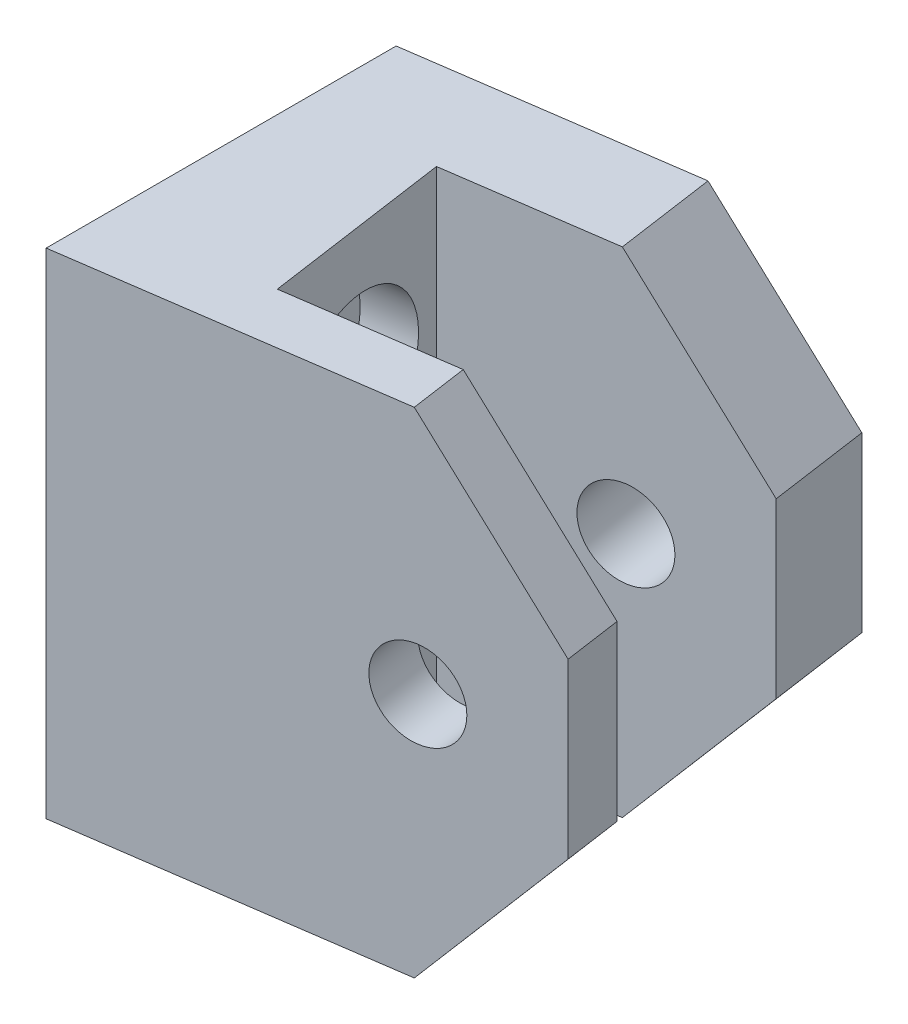
ISO-10303-21;
HEADER;
FILE_DESCRIPTION(('STEP AP214'),'2;1');
FILE_NAME('part.step','',(''),(''),'','','');
FILE_SCHEMA(('AUTOMOTIVE_DESIGN { 1 0 10303 214 1 1 1 1 }'));
ENDSEC;
DATA;
#1=APPLICATION_CONTEXT('core data for automotive mechanical design processes');
#2=APPLICATION_PROTOCOL_DEFINITION('international standard','automotive_design',2000,#1);
#3=PRODUCT_CONTEXT('',#1,'mechanical');
#4=PRODUCT('Part','Part','',(#3));
#5=PRODUCT_RELATED_PRODUCT_CATEGORY('part','',(#4));
#6=PRODUCT_DEFINITION_FORMATION('','',#4);
#7=PRODUCT_DEFINITION_CONTEXT('part definition',#1,'design');
#8=PRODUCT_DEFINITION('design','',#6,#7);
#9=PRODUCT_DEFINITION_SHAPE('','',#8);
#10=(LENGTH_UNIT() NAMED_UNIT(*) SI_UNIT(.MILLI.,.METRE.));
#11=(NAMED_UNIT(*) PLANE_ANGLE_UNIT() SI_UNIT($,.RADIAN.));
#12=(NAMED_UNIT(*) SI_UNIT($,.STERADIAN.) SOLID_ANGLE_UNIT());
#13=UNCERTAINTY_MEASURE_WITH_UNIT(LENGTH_MEASURE(1.E-05),#10,'distance_accuracy_value','');
#14=(GEOMETRIC_REPRESENTATION_CONTEXT(3) GLOBAL_UNCERTAINTY_ASSIGNED_CONTEXT((#13)) GLOBAL_UNIT_ASSIGNED_CONTEXT((#10,
#11,#12)) REPRESENTATION_CONTEXT('',''));
#15=CARTESIAN_POINT('',(0.,0.,0.));
#16=DIRECTION('',(0.,0.,1.));
#17=DIRECTION('',(1.,0.,0.));
#18=AXIS2_PLACEMENT_3D('',#15,#16,#17);
#19=CARTESIAN_POINT('',(-1.90500000579084,54.37886,33.9650340772844));
#20=DIRECTION('',(1.,0.,-8.04481674826941E-13));
#21=DIRECTION('',(-8.04481674826941E-13,0.,-1.));
#22=AXIS2_PLACEMENT_3D('',#19,#20,#21);
#23=PLANE('',#22);
#24=CARTESIAN_POINT('',(-1.9050000058044,39.88943,17.1191776297874));
#25=DIRECTION('',(1.,0.,-8.04481674826941E-13));
#26=DIRECTION('',(-8.04481674826941E-13,0.,-1.));
#27=AXIS2_PLACEMENT_3D('',#24,#25,#26);
#28=ELLIPSE('',#27,4.54608092387669,4.5);
#29=CARTESIAN_POINT('',(-1.90500000580805,39.88943,12.5730967059107));
#30=VERTEX_POINT('',#29);
#31=EDGE_CURVE('E50',#30,#30,#28,.T.);
#32=ORIENTED_EDGE('',*,*,#31,.T.);
#33=EDGE_LOOP('',(#32));
#34=FACE_BOUND('',#33,.T.);
#35=CARTESIAN_POINT('',(-1.9050000058044,14.48943,17.1191776297874));
#36=DIRECTION('',(1.,0.,-8.04481674826941E-13));
#37=DIRECTION('',(-8.04481674826941E-13,0.,-1.));
#38=AXIS2_PLACEMENT_3D('',#35,#36,#37);
#39=ELLIPSE('',#38,4.54608092387669,4.5);
#40=CARTESIAN_POINT('',(-1.90500000580805,14.48943,12.5730967059107));
#41=VERTEX_POINT('',#40);
#42=EDGE_CURVE('E215',#41,#41,#39,.T.);
#43=ORIENTED_EDGE('',*,*,#42,.T.);
#44=EDGE_LOOP('',(#43));
#45=FACE_BOUND('',#44,.T.);
#46=DIRECTION('',(8.04481674826941E-13,0.,1.));
#47=VECTOR('',#46,1.);
#48=CARTESIAN_POINT('',(-1.90500000579084,0.,33.9650340772844));
#49=LINE('',#48,#47);
#50=CARTESIAN_POINT('',(-1.90500000579084,0.,-4.5379477954834));
#51=VERTEX_POINT('',#50);
#52=CARTESIAN_POINT('',(-1.90500000579084,0.,33.9650340772844));
#53=VERTEX_POINT('',#52);
#54=EDGE_CURVE('E172',#51,#53,#49,.T.);
#55=ORIENTED_EDGE('',*,*,#54,.T.);
#56=DIRECTION('',(0.,-1.,0.));
#57=VECTOR('',#56,1.);
#58=CARTESIAN_POINT('',(-1.90500000579084,54.37886,33.9650340772844));
#59=LINE('',#58,#57);
#60=CARTESIAN_POINT('',(-1.90500000579084,54.37886,33.9650340772844));
#61=VERTEX_POINT('',#60);
#62=EDGE_CURVE('E206',#61,#53,#59,.T.);
#63=ORIENTED_EDGE('',*,*,#62,.F.);
#64=DIRECTION('',(0.,0.,1.));
#65=VECTOR('',#64,1.);
#66=CARTESIAN_POINT('',(-1.90500000579084,54.37886,-4.5379477954834));
#67=LINE('',#66,#65);
#68=CARTESIAN_POINT('',(-1.90500000579084,54.37886,-4.5379477954834));
#69=VERTEX_POINT('',#68);
#70=EDGE_CURVE('E155',#69,#61,#67,.T.);
#71=ORIENTED_EDGE('',*,*,#70,.F.);
#72=DIRECTION('',(0.,-1.,0.));
#73=VECTOR('',#72,1.);
#74=CARTESIAN_POINT('',(-1.90500000579084,54.37886,-4.5379477954834));
#75=LINE('',#74,#73);
#76=EDGE_CURVE('E171',#69,#51,#75,.T.);
#77=ORIENTED_EDGE('',*,*,#76,.T.);
#78=EDGE_LOOP('',(#55,#63,#71,#77));
#79=FACE_BOUND('',#78,.T.);
#80=ADVANCED_FACE('F47',(#34,#45,#79),#23,.F.);
#81=CARTESIAN_POINT('',(48.3131852579812,54.37886,26.7599455067536));
#82=DIRECTION('',(-0.142021357940423,0.,-0.989863593576791));
#83=DIRECTION('',(-0.989863593576791,0.,0.142021357940423));
#84=AXIS2_PLACEMENT_3D('',#81,#82,#83);
#85=PLANE('',#84);
#86=CARTESIAN_POINT('',(33.8562274737922,27.18943,28.8341674394736));
#87=DIRECTION('',(0.142021357940418,0.,0.989863593576792));
#88=DIRECTION('',(0.989863593576792,0.,-0.142021357940418));
#89=AXIS2_PLACEMENT_3D('',#86,#87,#88);
#90=CIRCLE('',#89,4.76249999681212);
#91=CARTESIAN_POINT('',(38.5704528350461,27.18943,28.1577907227351));
#92=VERTEX_POINT('',#91);
#93=EDGE_CURVE('E238',#92,#92,#90,.T.);
#94=ORIENTED_EDGE('',*,*,#93,.F.);
#95=EDGE_LOOP('',(#94));
#96=FACE_BOUND('',#95,.T.);
#97=DIRECTION('',(0.989863593576791,0.,-0.142021357940423));
#98=VECTOR('',#97,1.);
#99=CARTESIAN_POINT('',(48.3131852579812,0.,26.7599455067536));
#100=LINE('',#99,#98);
#101=CARTESIAN_POINT('',(33.513696223646,0.,28.8833123454973));
#102=VERTEX_POINT('',#101);
#103=EDGE_CURVE('E175',#53,#102,#100,.T.);
#104=ORIENTED_EDGE('',*,*,#103,.T.);
#105=DIRECTION('',(-0.639499728041495,-0.763296499953481,0.091752662051951));
#106=VECTOR('',#105,1.);
#107=CARTESIAN_POINT('',(48.3131852579813,17.66443,26.7599455067538));
#108=LINE('',#107,#106);
#109=CARTESIAN_POINT('',(48.3131852579813,17.66443,26.7599455067538));
#110=VERTEX_POINT('',#109);
#111=EDGE_CURVE('E217',#110,#102,#108,.T.);
#112=ORIENTED_EDGE('',*,*,#111,.F.);
#113=DIRECTION('',(0.,-1.,0.));
#114=VECTOR('',#113,1.);
#115=CARTESIAN_POINT('',(48.3131852579812,54.37886,26.7599455067536));
#116=LINE('',#115,#114);
#117=CARTESIAN_POINT('',(48.3131852579813,36.71443,26.7599455067538));
#118=VERTEX_POINT('',#117);
#119=EDGE_CURVE('E149',#118,#110,#116,.T.);
#120=ORIENTED_EDGE('',*,*,#119,.F.);
#121=DIRECTION('',(0.639499728041495,-0.763296499953481,-0.091752662051951));
#122=VECTOR('',#121,1.);
#123=CARTESIAN_POINT('',(48.3131852579813,36.71443,26.7599455067538));
#124=LINE('',#123,#122);
#125=CARTESIAN_POINT('',(33.513696223646,54.37886,28.8833123454975));
#126=VERTEX_POINT('',#125);
#127=EDGE_CURVE('E135',#126,#118,#124,.T.);
#128=ORIENTED_EDGE('',*,*,#127,.F.);
#129=DIRECTION('',(0.989863593576791,0.,-0.142021357940424));
#130=VECTOR('',#129,1.);
#131=CARTESIAN_POINT('',(-0.0215618187976437,54.37886,33.6948064917369));
#132=LINE('',#131,#130);
#133=EDGE_CURVE('E146',#61,#126,#132,.T.);
#134=ORIENTED_EDGE('',*,*,#133,.F.);
#135=ORIENTED_EDGE('',*,*,#62,.T.);
#136=EDGE_LOOP('',(#104,#112,#120,#128,#134,#135));
#137=FACE_BOUND('',#136,.T.);
#138=ADVANCED_FACE('F144',(#96,#137),#85,.F.);
#139=CARTESIAN_POINT('',(47.4113496350595,54.37886,20.474311687541));
#140=DIRECTION('',(-0.989863593576791,0.,0.142021357940424));
#141=DIRECTION('',(0.142021357940424,0.,0.989863593576791));
#142=AXIS2_PLACEMENT_3D('',#139,#140,#141);
#143=PLANE('',#142);
#144=ORIENTED_EDGE('',*,*,#119,.T.);
#145=DIRECTION('',(0.142021357940418,0.,0.989863593576792));
#146=VECTOR('',#145,1.);
#147=CARTESIAN_POINT('',(41.9966406174318,17.66443,-17.2652466724793));
#148=LINE('',#147,#146);
#149=CARTESIAN_POINT('',(47.4113496350596,17.66443,20.474311687541));
#150=VERTEX_POINT('',#149);
#151=EDGE_CURVE('E221',#150,#110,#148,.T.);
#152=ORIENTED_EDGE('',*,*,#151,.F.);
#153=DIRECTION('',(0.,-1.,0.));
#154=VECTOR('',#153,1.);
#155=CARTESIAN_POINT('',(47.4113496350595,54.37886,20.474311687541));
#156=LINE('',#155,#154);
#157=CARTESIAN_POINT('',(47.4113496350596,36.71443,20.474311687541));
#158=VERTEX_POINT('',#157);
#159=EDGE_CURVE('E202',#158,#150,#156,.T.);
#160=ORIENTED_EDGE('',*,*,#159,.F.);
#161=DIRECTION('',(0.142021357940418,0.,0.989863593576792));
#162=VECTOR('',#161,1.);
#163=CARTESIAN_POINT('',(41.9966406174318,36.71443,-17.2652466724793));
#164=LINE('',#163,#162);
#165=EDGE_CURVE('E150',#158,#118,#164,.T.);
#166=ORIENTED_EDGE('',*,*,#165,.T.);
#167=EDGE_LOOP('',(#144,#152,#160,#166));
#168=FACE_BOUND('',#167,.T.);
#169=ADVANCED_FACE('F283',(#168),#143,.F.);
#170=CARTESIAN_POINT('',(47.4113496350595,54.37886,20.474311687541));
#171=DIRECTION('',(0.142021357940423,0.,0.989863593576791));
#172=DIRECTION('',(0.989863593576791,0.,-0.142021357940423));
#173=AXIS2_PLACEMENT_3D('',#170,#171,#172);
#174=PLANE('',#173);
#175=CARTESIAN_POINT('',(32.9543918508706,27.18943,22.5485336202608));
#176=DIRECTION('',(0.142021357940423,0.,0.989863593576791));
#177=DIRECTION('',(0.989863593576791,0.,-0.142021357940423));
#178=AXIS2_PLACEMENT_3D('',#175,#176,#177);
#179=CIRCLE('',#178,4.76249999681212);
#180=CARTESIAN_POINT('',(37.6686172121245,27.18943,21.8721569035223));
#181=VERTEX_POINT('',#180);
#182=EDGE_CURVE('E176',#181,#181,#179,.T.);
#183=ORIENTED_EDGE('',*,*,#182,.T.);
#184=EDGE_LOOP('',(#183));
#185=FACE_BOUND('',#184,.T.);
#186=ORIENTED_EDGE('',*,*,#159,.T.);
#187=DIRECTION('',(-0.639499728041494,-0.763296499953481,0.091752662051954));
#188=VECTOR('',#187,1.);
#189=CARTESIAN_POINT('',(65.3326874024808,39.0550479979942,17.9030354608427));
#190=LINE('',#189,#188);
#191=CARTESIAN_POINT('',(32.6118606007243,0.,22.5976785262847));
#192=VERTEX_POINT('',#191);
#193=EDGE_CURVE('E248',#150,#192,#190,.T.);
#194=ORIENTED_EDGE('',*,*,#193,.T.);
#195=DIRECTION('',(-0.989863593576791,0.,0.142021357940423));
#196=VECTOR('',#195,1.);
#197=CARTESIAN_POINT('',(47.4113496350595,0.,20.474311687541));
#198=LINE('',#197,#196);
#199=CARTESIAN_POINT('',(14.7260537751539,0.,25.1638569267337));
#200=VERTEX_POINT('',#199);
#201=EDGE_CURVE('E178',#192,#200,#198,.T.);
#202=ORIENTED_EDGE('',*,*,#201,.T.);
#203=DIRECTION('',(0.,-1.,0.));
#204=VECTOR('',#203,1.);
#205=CARTESIAN_POINT('',(14.7260537751539,54.37886,25.1638569267337));
#206=LINE('',#205,#204);
#207=CARTESIAN_POINT('',(14.7260537751539,54.37886,25.1638569267337));
#208=VERTEX_POINT('',#207);
#209=EDGE_CURVE('E198',#208,#200,#206,.T.);
#210=ORIENTED_EDGE('',*,*,#209,.F.);
#211=DIRECTION('',(-0.989863593576791,0.,0.142021357940423));
#212=VECTOR('',#211,1.);
#213=CARTESIAN_POINT('',(47.4113496350595,54.37886,20.474311687541));
#214=LINE('',#213,#212);
#215=CARTESIAN_POINT('',(32.6118606007243,54.37886,22.5976785262847));
#216=VERTEX_POINT('',#215);
#217=EDGE_CURVE('E157',#216,#208,#214,.T.);
#218=ORIENTED_EDGE('',*,*,#217,.F.);
#219=DIRECTION('',(0.639499728041494,-0.763296499953481,-0.091752662051954));
#220=VECTOR('',#219,1.);
#221=CARTESIAN_POINT('',(38.7888484414153,47.0061075306687,21.7114309596412));
#222=LINE('',#221,#220);
#223=EDGE_CURVE('E71',#216,#158,#222,.T.);
#224=ORIENTED_EDGE('',*,*,#223,.T.);
#225=EDGE_LOOP('',(#186,#194,#202,#210,#218,#224));
#226=FACE_BOUND('',#225,.T.);
#227=ADVANCED_FACE('F260',(#185,#226),#174,.F.);
#228=CARTESIAN_POINT('',(14.7260537751539,54.37886,25.1638569267337));
#229=DIRECTION('',(-0.989863593576791,0.,0.142021357940423));
#230=DIRECTION('',(0.142021357940423,0.,0.989863593576791));
#231=AXIS2_PLACEMENT_3D('',#228,#229,#230);
#232=PLANE('',#231);
#233=CARTESIAN_POINT('',(13.2596690522831,39.88943,14.9434163366941));
#234=DIRECTION('',(0.989863593576792,0.,-0.142021357940418));
#235=DIRECTION('',(-0.142021357940418,0.,-0.989863593576792));
#236=AXIS2_PLACEMENT_3D('',#233,#234,#235);
#237=CIRCLE('',#236,8.);
#238=CARTESIAN_POINT('',(12.1234981887598,39.88943,7.02450758807973));
#239=VERTEX_POINT('',#238);
#240=EDGE_CURVE('E516',#239,#239,#237,.T.);
#241=ORIENTED_EDGE('',*,*,#240,.F.);
#242=EDGE_LOOP('',(#241));
#243=FACE_BOUND('',#242,.T.);
#244=CARTESIAN_POINT('',(13.2596690522831,14.48943,14.9434163366941));
#245=DIRECTION('',(0.989863593576792,0.,-0.142021357940418));
#246=DIRECTION('',(-0.142021357940418,0.,-0.989863593576792));
#247=AXIS2_PLACEMENT_3D('',#244,#245,#246);
#248=CIRCLE('',#247,8.);
#249=CARTESIAN_POINT('',(12.1234981887598,14.48943,7.02450758807973));
#250=VERTEX_POINT('',#249);
#251=EDGE_CURVE('E231',#250,#250,#248,.T.);
#252=ORIENTED_EDGE('',*,*,#251,.F.);
#253=EDGE_LOOP('',(#252));
#254=FACE_BOUND('',#253,.T.);
#255=DIRECTION('',(-0.142021357940423,0.,-0.989863593576791));
#256=VECTOR('',#255,1.);
#257=CARTESIAN_POINT('',(14.7260537751539,0.,25.1638569267337));
#258=LINE('',#257,#256);
#259=CARTESIAN_POINT('',(11.7932843294126,0.,4.72297574665434));
#260=VERTEX_POINT('',#259);
#261=EDGE_CURVE('E180',#200,#260,#258,.T.);
#262=ORIENTED_EDGE('',*,*,#261,.T.);
#263=DIRECTION('',(0.,-1.,0.));
#264=VECTOR('',#263,1.);
#265=CARTESIAN_POINT('',(11.7932843294126,54.37886,4.72297574665434));
#266=LINE('',#265,#264);
#267=CARTESIAN_POINT('',(11.7932843294126,54.37886,4.72297574665434));
#268=VERTEX_POINT('',#267);
#269=EDGE_CURVE('E194',#268,#260,#266,.T.);
#270=ORIENTED_EDGE('',*,*,#269,.F.);
#271=DIRECTION('',(-0.142021357940423,0.,-0.989863593576791));
#272=VECTOR('',#271,1.);
#273=CARTESIAN_POINT('',(14.7260537751539,54.37886,25.1638569267337));
#274=LINE('',#273,#272);
#275=EDGE_CURVE('E159',#208,#268,#274,.T.);
#276=ORIENTED_EDGE('',*,*,#275,.F.);
#277=ORIENTED_EDGE('',*,*,#209,.T.);
#278=EDGE_LOOP('',(#262,#270,#276,#277));
#279=FACE_BOUND('',#278,.T.);
#280=ADVANCED_FACE('F307',(#243,#254,#279),#232,.F.);
#281=CARTESIAN_POINT('',(11.7932843294126,54.37886,4.72297574665434));
#282=DIRECTION('',(-0.142021357940422,0.,-0.989863593576791));
#283=DIRECTION('',(-0.989863593576791,0.,0.142021357940422));
#284=AXIS2_PLACEMENT_3D('',#281,#282,#283);
#285=PLANE('',#284);
#286=CARTESIAN_POINT('',(30.0216224051293,27.18943,2.10765244018144));
#287=DIRECTION('',(-0.142021357940422,0.,-0.989863593576791));
#288=DIRECTION('',(-0.989863593576791,0.,0.142021357940422));
#289=AXIS2_PLACEMENT_3D('',#286,#287,#288);
#290=CIRCLE('',#289,4.76249999681212);
#291=CARTESIAN_POINT('',(25.3073970438754,27.18943,2.78402915691995));
#292=VERTEX_POINT('',#291);
#293=EDGE_CURVE('E214',#292,#292,#290,.T.);
#294=ORIENTED_EDGE('',*,*,#293,.T.);
#295=EDGE_LOOP('',(#294));
#296=FACE_BOUND('',#295,.T.);
#297=DIRECTION('',(0.989863593576791,0.,-0.142021357940422));
#298=VECTOR('',#297,1.);
#299=CARTESIAN_POINT('',(11.7932843294126,0.,4.72297574665434));
#300=LINE('',#299,#298);
#301=CARTESIAN_POINT('',(29.6790911549831,0.,2.15679734620532));
#302=VERTEX_POINT('',#301);
#303=EDGE_CURVE('E182',#260,#302,#300,.T.);
#304=ORIENTED_EDGE('',*,*,#303,.T.);
#305=DIRECTION('',(0.639499728041494,0.763296499953481,-0.0917526620519537));
#306=VECTOR('',#305,1.);
#307=CARTESIAN_POINT('',(48.7577797296956,22.7720131443677,-0.580530581284393));
#308=LINE('',#307,#306);
#309=CARTESIAN_POINT('',(44.4785801893184,17.66443,0.0334305074615772));
#310=VERTEX_POINT('',#309);
#311=EDGE_CURVE('E245',#302,#310,#308,.T.);
#312=ORIENTED_EDGE('',*,*,#311,.T.);
#313=DIRECTION('',(0.,-1.,0.));
#314=VECTOR('',#313,1.);
#315=CARTESIAN_POINT('',(44.4785801893182,54.37886,0.0334305074615998));
#316=LINE('',#315,#314);
#317=CARTESIAN_POINT('',(44.4785801893184,36.71443,0.0334305074615772));
#318=VERTEX_POINT('',#317);
#319=EDGE_CURVE('E191',#318,#310,#316,.T.);
#320=ORIENTED_EDGE('',*,*,#319,.F.);
#321=DIRECTION('',(-0.639499728041494,0.763296499953481,0.0917526620519537));
#322=VECTOR('',#321,1.);
#323=CARTESIAN_POINT('',(22.21394076863,63.2891423842952,3.22786491751417));
#324=LINE('',#323,#322);
#325=CARTESIAN_POINT('',(29.6790911549831,54.37886,2.15679734620532));
#326=VERTEX_POINT('',#325);
#327=EDGE_CURVE('E252',#318,#326,#324,.T.);
#328=ORIENTED_EDGE('',*,*,#327,.T.);
#329=DIRECTION('',(0.989863593576791,0.,-0.142021357940422));
#330=VECTOR('',#329,1.);
#331=CARTESIAN_POINT('',(11.7932843294126,54.37886,4.72297574665434));
#332=LINE('',#331,#330);
#333=EDGE_CURVE('E166',#268,#326,#332,.T.);
#334=ORIENTED_EDGE('',*,*,#333,.F.);
#335=ORIENTED_EDGE('',*,*,#269,.T.);
#336=EDGE_LOOP('',(#304,#312,#320,#328,#334,#335));
#337=FACE_BOUND('',#336,.T.);
#338=ADVANCED_FACE('F312',(#296,#337),#285,.F.);
#339=CARTESIAN_POINT('',(44.4785801893182,54.37886,0.0334305074615998));
#340=DIRECTION('',(-0.989863593576791,0.,0.142021357940424));
#341=DIRECTION('',(0.142021357940424,0.,0.989863593576791));
#342=AXIS2_PLACEMENT_3D('',#339,#340,#341);
#343=PLANE('',#342);
#344=ORIENTED_EDGE('',*,*,#319,.T.);
#345=CARTESIAN_POINT('',(42.9003678492055,17.66443,-10.9664286761605));
#346=VERTEX_POINT('',#345);
#347=EDGE_CURVE('E151',#346,#310,#148,.T.);
#348=ORIENTED_EDGE('',*,*,#347,.F.);
#349=DIRECTION('',(0.,-1.,0.));
#350=VECTOR('',#349,1.);
#351=CARTESIAN_POINT('',(42.9003678492052,54.37886,-10.9664286761605));
#352=LINE('',#351,#350);
#353=CARTESIAN_POINT('',(42.9003678492055,36.71443,-10.9664286761605));
#354=VERTEX_POINT('',#353);
#355=EDGE_CURVE('E188',#354,#346,#352,.T.);
#356=ORIENTED_EDGE('',*,*,#355,.F.);
#357=EDGE_CURVE('E235',#354,#318,#164,.T.);
#358=ORIENTED_EDGE('',*,*,#357,.T.);
#359=EDGE_LOOP('',(#344,#348,#356,#358));
#360=FACE_BOUND('',#359,.T.);
#361=ADVANCED_FACE('F316',(#360),#343,.F.);
#362=CARTESIAN_POINT('',(42.9003678492052,54.37886,-10.9664286761605));
#363=DIRECTION('',(0.142021357940423,0.,0.989863593576791));
#364=DIRECTION('',(0.989863593576791,0.,-0.142021357940423));
#365=AXIS2_PLACEMENT_3D('',#362,#363,#364);
#366=PLANE('',#365);
#367=CARTESIAN_POINT('',(28.4434100650164,27.18943,-8.89220674344066));
#368=DIRECTION('',(0.142021357940423,0.,0.989863593576791));
#369=DIRECTION('',(0.989863593576791,0.,-0.142021357940423));
#370=AXIS2_PLACEMENT_3D('',#367,#368,#369);
#371=CIRCLE('',#370,4.76249999681212);
#372=CARTESIAN_POINT('',(33.1576354262703,27.18943,-9.56858346017918));
#373=VERTEX_POINT('',#372);
#374=EDGE_CURVE('E212',#373,#373,#371,.T.);
#375=ORIENTED_EDGE('',*,*,#374,.T.);
#376=EDGE_LOOP('',(#375));
#377=FACE_BOUND('',#376,.T.);
#378=ORIENTED_EDGE('',*,*,#355,.T.);
#379=DIRECTION('',(-0.639499728041494,-0.763296499953481,0.0917526620519543));
#380=VECTOR('',#379,1.);
#381=CARTESIAN_POINT('',(60.8217056166267,39.0550479979941,-13.5377049028588));
#382=LINE('',#381,#380);
#383=CARTESIAN_POINT('',(28.1008788148702,0.,-8.84306183741677));
#384=VERTEX_POINT('',#383);
#385=EDGE_CURVE('E242',#346,#384,#382,.T.);
#386=ORIENTED_EDGE('',*,*,#385,.T.);
#387=DIRECTION('',(-0.989863593576791,0.,0.142021357940423));
#388=VECTOR('',#387,1.);
#389=CARTESIAN_POINT('',(42.9003678492052,0.,-10.9664286761605));
#390=LINE('',#389,#388);
#391=EDGE_CURVE('E161',#384,#51,#390,.T.);
#392=ORIENTED_EDGE('',*,*,#391,.T.);
#393=ORIENTED_EDGE('',*,*,#76,.F.);
#394=DIRECTION('',(-0.989863593576791,0.,0.142021357940423));
#395=VECTOR('',#394,1.);
#396=CARTESIAN_POINT('',(42.9003678492052,54.37886,-10.9664286761605));
#397=LINE('',#396,#395);
#398=CARTESIAN_POINT('',(28.1008788148702,54.37886,-8.84306183741677));
#399=VERTEX_POINT('',#398);
#400=EDGE_CURVE('E169',#399,#69,#397,.T.);
#401=ORIENTED_EDGE('',*,*,#400,.F.);
#402=DIRECTION('',(0.639499728041494,-0.763296499953481,-0.0917526620519543));
#403=VECTOR('',#402,1.);
#404=CARTESIAN_POINT('',(34.2778666555611,47.0061075306688,-9.72930940406025));
#405=LINE('',#404,#403);
#406=EDGE_CURVE('E63',#399,#354,#405,.T.);
#407=ORIENTED_EDGE('',*,*,#406,.T.);
#408=EDGE_LOOP('',(#378,#386,#392,#393,#401,#407));
#409=FACE_BOUND('',#408,.T.);
#410=ADVANCED_FACE('F320',(#377,#409),#366,.F.);
#411=CARTESIAN_POINT('',(0.,54.37886,0.));
#412=DIRECTION('',(0.,-1.,0.));
#413=DIRECTION('',(0.,0.,-1.));
#414=AXIS2_PLACEMENT_3D('',#411,#412,#413);
#415=PLANE('',#414);
#416=ORIENTED_EDGE('',*,*,#133,.T.);
#417=DIRECTION('',(-0.142021357940418,0.,-0.989863593576792));
#418=VECTOR('',#417,1.);
#419=CARTESIAN_POINT('',(28.7772555320615,54.37886,-4.12883647300715));
#420=LINE('',#419,#418);
#421=EDGE_CURVE('E11',#126,#216,#420,.T.);
#422=ORIENTED_EDGE('',*,*,#421,.T.);
#423=ORIENTED_EDGE('',*,*,#217,.T.);
#424=ORIENTED_EDGE('',*,*,#275,.T.);
#425=ORIENTED_EDGE('',*,*,#333,.T.);
#426=EDGE_CURVE('E55',#326,#399,#420,.T.);
#427=ORIENTED_EDGE('',*,*,#426,.T.);
#428=ORIENTED_EDGE('',*,*,#400,.T.);
#429=ORIENTED_EDGE('',*,*,#70,.T.);
#430=EDGE_LOOP('',(#416,#422,#423,#424,#425,#427,#428,#429));
#431=FACE_BOUND('',#430,.T.);
#432=ADVANCED_FACE('F153',(#431),#415,.F.);
#433=CARTESIAN_POINT('',(0.,0.,0.));
#434=DIRECTION('',(0.,-1.,0.));
#435=DIRECTION('',(0.,0.,-1.));
#436=AXIS2_PLACEMENT_3D('',#433,#434,#435);
#437=PLANE('',#436);
#438=DIRECTION('',(-0.142021357940418,0.,-0.989863593576792));
#439=VECTOR('',#438,1.);
#440=CARTESIAN_POINT('',(28.7772555320615,0.,-4.12883647300715));
#441=LINE('',#440,#439);
#442=EDGE_CURVE('E210',#102,#192,#441,.T.);
#443=ORIENTED_EDGE('',*,*,#442,.F.);
#444=ORIENTED_EDGE('',*,*,#103,.F.);
#445=ORIENTED_EDGE('',*,*,#54,.F.);
#446=ORIENTED_EDGE('',*,*,#391,.F.);
#447=EDGE_CURVE('E209',#302,#384,#441,.T.);
#448=ORIENTED_EDGE('',*,*,#447,.F.);
#449=ORIENTED_EDGE('',*,*,#303,.F.);
#450=ORIENTED_EDGE('',*,*,#261,.F.);
#451=ORIENTED_EDGE('',*,*,#201,.F.);
#452=EDGE_LOOP('',(#443,#444,#445,#446,#448,#449,#450,#451));
#453=FACE_BOUND('',#452,.T.);
#454=ADVANCED_FACE('F293',(#453),#437,.T.);
#455=CARTESIAN_POINT('',(41.9966406174318,17.66443,-17.2652466724793));
#456=DIRECTION('',(-0.75555941640854,0.646048336549801,0.108404405434562));
#457=DIRECTION('',(-0.649878147761172,-0.760038415517603,0.));
#458=AXIS2_PLACEMENT_3D('',#455,#456,#457);
#459=PLANE('',#458);
#460=ORIENTED_EDGE('',*,*,#447,.T.);
#461=ORIENTED_EDGE('',*,*,#385,.F.);
#462=ORIENTED_EDGE('',*,*,#347,.T.);
#463=ORIENTED_EDGE('',*,*,#311,.F.);
#464=EDGE_LOOP('',(#460,#461,#462,#463));
#465=FACE_BOUND('',#464,.T.);
#466=ADVANCED_FACE('F326',(#465),#459,.F.);
#467=ORIENTED_EDGE('',*,*,#151,.T.);
#468=ORIENTED_EDGE('',*,*,#111,.T.);
#469=ORIENTED_EDGE('',*,*,#442,.T.);
#470=ORIENTED_EDGE('',*,*,#193,.F.);
#471=EDGE_LOOP('',(#467,#468,#469,#470));
#472=FACE_BOUND('',#471,.T.);
#473=ADVANCED_FACE('F297',(#472),#459,.F.);
#474=CARTESIAN_POINT('',(41.9966406174318,36.71443,-17.2652466724793));
#475=DIRECTION('',(-0.75555941640854,-0.646048336549801,0.108404405434562));
#476=DIRECTION('',(0.649878147761172,-0.760038415517603,0.));
#477=AXIS2_PLACEMENT_3D('',#474,#475,#476);
#478=PLANE('',#477);
#479=ORIENTED_EDGE('',*,*,#357,.F.);
#480=ORIENTED_EDGE('',*,*,#406,.F.);
#481=ORIENTED_EDGE('',*,*,#426,.F.);
#482=ORIENTED_EDGE('',*,*,#327,.F.);
#483=EDGE_LOOP('',(#479,#480,#481,#482));
#484=FACE_BOUND('',#483,.T.);
#485=ADVANCED_FACE('F349',(#484),#478,.F.);
#486=ORIENTED_EDGE('',*,*,#421,.F.);
#487=ORIENTED_EDGE('',*,*,#127,.T.);
#488=ORIENTED_EDGE('',*,*,#165,.F.);
#489=ORIENTED_EDGE('',*,*,#223,.F.);
#490=EDGE_LOOP('',(#486,#487,#488,#489));
#491=FACE_BOUND('',#490,.T.);
#492=ADVANCED_FACE('F134',(#491),#478,.F.);
#493=CARTESIAN_POINT('',(27.5396828332427,27.18943,-15.1910247397595));
#494=DIRECTION('',(0.142021357940418,0.,0.989863593576792));
#495=DIRECTION('',(0.989863593576792,0.,-0.142021357940418));
#496=AXIS2_PLACEMENT_3D('',#493,#494,#495);
#497=CYLINDRICAL_SURFACE('',#496,4.76249999681212);
#498=ORIENTED_EDGE('',*,*,#374,.F.);
#499=EDGE_LOOP('',(#498));
#500=FACE_BOUND('',#499,.T.);
#501=ORIENTED_EDGE('',*,*,#293,.F.);
#502=EDGE_LOOP('',(#501));
#503=FACE_BOUND('',#502,.T.);
#504=ADVANCED_FACE('F266',(#500,#503),#497,.F.);
#505=ORIENTED_EDGE('',*,*,#93,.T.);
#506=EDGE_LOOP('',(#505));
#507=FACE_BOUND('',#506,.T.);
#508=ORIENTED_EDGE('',*,*,#182,.F.);
#509=EDGE_LOOP('',(#508));
#510=FACE_BOUND('',#509,.T.);
#511=ADVANCED_FACE('F263',(#507,#510),#497,.F.);
#512=CARTESIAN_POINT('',(13.2596690522831,14.48943,14.9434163366941));
#513=DIRECTION('',(0.989863593576792,0.,-0.142021357940418));
#514=DIRECTION('',(-0.142021357940418,0.,-0.989863593576792));
#515=AXIS2_PLACEMENT_3D('',#512,#513,#514);
#516=CYLINDRICAL_SURFACE('',#515,4.5);
#517=CARTESIAN_POINT('',(7.63724384076696,14.48943,15.7500976497956));
#518=DIRECTION('',(0.989863593576792,0.,-0.142021357940418));
#519=DIRECTION('',(-0.142021357940418,0.,-0.989863593576792));
#520=AXIS2_PLACEMENT_3D('',#517,#518,#519);
#521=CIRCLE('',#520,4.5);
#522=CARTESIAN_POINT('',(6.99814773003508,14.48943,11.2957114787001));
#523=VERTEX_POINT('',#522);
#524=EDGE_CURVE('E218',#523,#523,#521,.T.);
#525=ORIENTED_EDGE('',*,*,#524,.T.);
#526=EDGE_LOOP('',(#525));
#527=FACE_BOUND('',#526,.T.);
#528=ORIENTED_EDGE('',*,*,#42,.F.);
#529=EDGE_LOOP('',(#528));
#530=FACE_BOUND('',#529,.T.);
#531=ADVANCED_FACE('F265',(#527,#530),#516,.F.);
#532=CARTESIAN_POINT('',(7.63724384076697,18.98943,15.7500976497956));
#533=DIRECTION('',(-0.989863593576792,0.,0.142021357940418));
#534=DIRECTION('',(0.142021357940418,0.,0.989863593576792));
#535=AXIS2_PLACEMENT_3D('',#532,#533,#534);
#536=PLANE('',#535);
#537=ORIENTED_EDGE('',*,*,#524,.F.);
#538=EDGE_LOOP('',(#537));
#539=FACE_BOUND('',#538,.T.);
#540=CARTESIAN_POINT('',(7.63724384076696,14.48943,15.7500976497956));
#541=DIRECTION('',(0.989863593576792,0.,-0.142021357940418));
#542=DIRECTION('',(-0.142021357940418,0.,-0.989863593576792));
#543=AXIS2_PLACEMENT_3D('',#540,#541,#542);
#544=CIRCLE('',#543,8.);
#545=CARTESIAN_POINT('',(6.50107297724362,14.48943,7.83118890118131));
#546=VERTEX_POINT('',#545);
#547=EDGE_CURVE('E225',#546,#546,#544,.T.);
#548=ORIENTED_EDGE('',*,*,#547,.T.);
#549=EDGE_LOOP('',(#548));
#550=FACE_BOUND('',#549,.T.);
#551=ADVANCED_FACE('F273',(#539,#550),#536,.F.);
#552=CARTESIAN_POINT('',(13.2596690522831,14.48943,14.9434163366941));
#553=DIRECTION('',(0.989863593576792,0.,-0.142021357940418));
#554=DIRECTION('',(-0.142021357940418,0.,-0.989863593576792));
#555=AXIS2_PLACEMENT_3D('',#552,#553,#554);
#556=CYLINDRICAL_SURFACE('',#555,8.);
#557=ORIENTED_EDGE('',*,*,#547,.F.);
#558=EDGE_LOOP('',(#557));
#559=FACE_BOUND('',#558,.T.);
#560=ORIENTED_EDGE('',*,*,#251,.T.);
#561=EDGE_LOOP('',(#560));
#562=FACE_BOUND('',#561,.T.);
#563=ADVANCED_FACE('F369',(#559,#562),#556,.F.);
#564=CARTESIAN_POINT('',(13.2596690522831,39.88943,14.9434163366941));
#565=DIRECTION('',(0.989863593576792,0.,-0.142021357940418));
#566=DIRECTION('',(-0.142021357940418,0.,-0.989863593576792));
#567=AXIS2_PLACEMENT_3D('',#564,#565,#566);
#568=CYLINDRICAL_SURFACE('',#567,4.5);
#569=CARTESIAN_POINT('',(7.63724384076696,39.88943,15.7500976497956));
#570=DIRECTION('',(0.989863593576792,0.,-0.142021357940418));
#571=DIRECTION('',(-0.142021357940418,0.,-0.989863593576792));
#572=AXIS2_PLACEMENT_3D('',#569,#570,#571);
#573=CIRCLE('',#572,4.5);
#574=CARTESIAN_POINT('',(6.99814773003508,39.88943,11.2957114787001));
#575=VERTEX_POINT('',#574);
#576=EDGE_CURVE('E509',#575,#575,#573,.T.);
#577=ORIENTED_EDGE('',*,*,#576,.T.);
#578=EDGE_LOOP('',(#577));
#579=FACE_BOUND('',#578,.T.);
#580=ORIENTED_EDGE('',*,*,#31,.F.);
#581=EDGE_LOOP('',(#580));
#582=FACE_BOUND('',#581,.T.);
#583=ADVANCED_FACE('F373',(#579,#582),#568,.F.);
#584=CARTESIAN_POINT('',(7.63724384076697,44.38943,15.7500976497956));
#585=DIRECTION('',(-0.989863593576792,0.,0.142021357940418));
#586=DIRECTION('',(0.142021357940418,0.,0.989863593576792));
#587=AXIS2_PLACEMENT_3D('',#584,#585,#586);
#588=PLANE('',#587);
#589=ORIENTED_EDGE('',*,*,#576,.F.);
#590=EDGE_LOOP('',(#589));
#591=FACE_BOUND('',#590,.T.);
#592=CARTESIAN_POINT('',(7.63724384076696,39.88943,15.7500976497956));
#593=DIRECTION('',(0.989863593576792,0.,-0.142021357940418));
#594=DIRECTION('',(-0.142021357940418,0.,-0.989863593576792));
#595=AXIS2_PLACEMENT_3D('',#592,#593,#594);
#596=CIRCLE('',#595,8.);
#597=CARTESIAN_POINT('',(6.50107297724362,39.88943,7.83118890118131));
#598=VERTEX_POINT('',#597);
#599=EDGE_CURVE('E513',#598,#598,#596,.T.);
#600=ORIENTED_EDGE('',*,*,#599,.T.);
#601=EDGE_LOOP('',(#600));
#602=FACE_BOUND('',#601,.T.);
#603=ADVANCED_FACE('F386',(#591,#602),#588,.F.);
#604=CARTESIAN_POINT('',(13.2596690522831,39.88943,14.9434163366941));
#605=DIRECTION('',(0.989863593576792,0.,-0.142021357940418));
#606=DIRECTION('',(-0.142021357940418,0.,-0.989863593576792));
#607=AXIS2_PLACEMENT_3D('',#604,#605,#606);
#608=CYLINDRICAL_SURFACE('',#607,8.);
#609=ORIENTED_EDGE('',*,*,#599,.F.);
#610=EDGE_LOOP('',(#609));
#611=FACE_BOUND('',#610,.T.);
#612=ORIENTED_EDGE('',*,*,#240,.T.);
#613=EDGE_LOOP('',(#612));
#614=FACE_BOUND('',#613,.T.);
#615=ADVANCED_FACE('F383',(#611,#614),#608,.F.);
#616=CLOSED_SHELL('',(#80,#138,#169,#227,#280,#338,#361,#410,#432,#454,#466,#473,#485,#492,#504,
#511,#531,#551,#563,#583,#603,#615));
#617=MANIFOLD_SOLID_BREP('B2',#616);
#618=ADVANCED_BREP_SHAPE_REPRESENTATION('',(#18,#617),#14);
#619=SHAPE_DEFINITION_REPRESENTATION(#9,#618);
ENDSEC;
END-ISO-10303-21;
